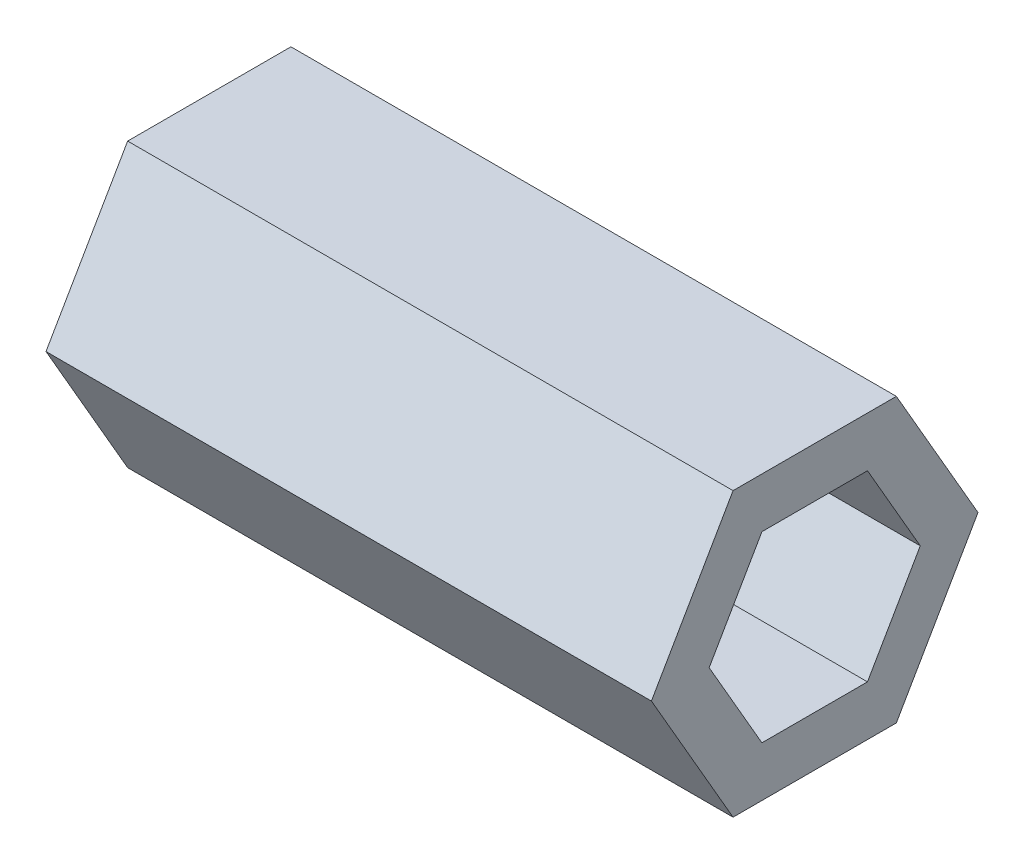
ISO-10303-21;
HEADER;
FILE_DESCRIPTION(('STEP AP214'),'2;1');
FILE_NAME('part.step','',(''),(''),'','','');
FILE_SCHEMA(('AUTOMOTIVE_DESIGN { 1 0 10303 214 1 1 1 1 }'));
ENDSEC;
DATA;
#1=APPLICATION_CONTEXT('core data for automotive mechanical design processes');
#2=APPLICATION_PROTOCOL_DEFINITION('international standard','automotive_design',2000,#1);
#3=PRODUCT_CONTEXT('',#1,'mechanical');
#4=PRODUCT('Part','Part','',(#3));
#5=PRODUCT_RELATED_PRODUCT_CATEGORY('part','',(#4));
#6=PRODUCT_DEFINITION_FORMATION('','',#4);
#7=PRODUCT_DEFINITION_CONTEXT('part definition',#1,'design');
#8=PRODUCT_DEFINITION('design','',#6,#7);
#9=PRODUCT_DEFINITION_SHAPE('','',#8);
#10=(LENGTH_UNIT() NAMED_UNIT(*) SI_UNIT(.MILLI.,.METRE.));
#11=(NAMED_UNIT(*) PLANE_ANGLE_UNIT() SI_UNIT($,.RADIAN.));
#12=(NAMED_UNIT(*) SI_UNIT($,.STERADIAN.) SOLID_ANGLE_UNIT());
#13=UNCERTAINTY_MEASURE_WITH_UNIT(LENGTH_MEASURE(1.E-05),#10,'distance_accuracy_value','');
#14=(GEOMETRIC_REPRESENTATION_CONTEXT(3) GLOBAL_UNCERTAINTY_ASSIGNED_CONTEXT((#13)) GLOBAL_UNIT_ASSIGNED_CONTEXT((#10,
#11,#12)) REPRESENTATION_CONTEXT('',''));
#15=CARTESIAN_POINT('',(0.,0.,0.));
#16=DIRECTION('',(0.,0.,1.));
#17=DIRECTION('',(1.,0.,0.));
#18=AXIS2_PLACEMENT_3D('',#15,#16,#17);
#19=CARTESIAN_POINT('',(2.54,0.,0.));
#20=DIRECTION('',(1.,0.,0.));
#21=DIRECTION('',(0.,0.,-1.));
#22=AXIS2_PLACEMENT_3D('',#19,#20,#21);
#23=PLANE('',#22);
#24=DIRECTION('',(0.,0.866025403784441,-0.499999999999995));
#25=VECTOR('',#24,1.);
#26=CARTESIAN_POINT('',(2.54,-5.33953978372522,-3.08278473148255));
#27=LINE('',#26,#25);
#28=CARTESIAN_POINT('',(2.54,-5.33953978372522,-3.08278473148255));
#29=VERTEX_POINT('',#28);
#30=CARTESIAN_POINT('',(2.54,0.,-6.16556946296498));
#31=VERTEX_POINT('',#30);
#32=EDGE_CURVE('E247',#29,#31,#27,.T.);
#33=ORIENTED_EDGE('',*,*,#32,.F.);
#34=DIRECTION('',(0.,0.,-1.));
#35=VECTOR('',#34,1.);
#36=CARTESIAN_POINT('',(2.54,-5.33953978372528,3.08278473148244));
#37=LINE('',#36,#35);
#38=CARTESIAN_POINT('',(2.54,-5.33953978372528,3.08278473148244));
#39=VERTEX_POINT('',#38);
#40=EDGE_CURVE('E263',#39,#29,#37,.T.);
#41=ORIENTED_EDGE('',*,*,#40,.F.);
#42=DIRECTION('',(0.,-0.866025403784435,-0.500000000000007));
#43=VECTOR('',#42,1.);
#44=CARTESIAN_POINT('',(2.54,0.,6.16556946296498));
#45=LINE('',#44,#43);
#46=CARTESIAN_POINT('',(2.54,0.,6.16556946296498));
#47=VERTEX_POINT('',#46);
#48=EDGE_CURVE('E260',#47,#39,#45,.T.);
#49=ORIENTED_EDGE('',*,*,#48,.F.);
#50=DIRECTION('',(0.,-0.866025403784441,0.499999999999995));
#51=VECTOR('',#50,1.);
#52=CARTESIAN_POINT('',(2.54,5.33953978372524,3.08278473148252));
#53=LINE('',#52,#51);
#54=CARTESIAN_POINT('',(2.54,5.33953978372524,3.08278473148252));
#55=VERTEX_POINT('',#54);
#56=EDGE_CURVE('E257',#55,#47,#53,.T.);
#57=ORIENTED_EDGE('',*,*,#56,.F.);
#58=DIRECTION('',(0.,0.,1.));
#59=VECTOR('',#58,1.);
#60=CARTESIAN_POINT('',(2.54,5.33953978372526,-3.08278473148248));
#61=LINE('',#60,#59);
#62=CARTESIAN_POINT('',(2.54,5.33953978372526,-3.08278473148248));
#63=VERTEX_POINT('',#62);
#64=EDGE_CURVE('E254',#63,#55,#61,.T.);
#65=ORIENTED_EDGE('',*,*,#64,.F.);
#66=DIRECTION('',(0.,0.866025403784438,0.500000000000001));
#67=VECTOR('',#66,1.);
#68=CARTESIAN_POINT('',(2.54,0.,-6.16556946296498));
#69=LINE('',#68,#67);
#70=EDGE_CURVE('E250',#31,#63,#69,.T.);
#71=ORIENTED_EDGE('',*,*,#70,.F.);
#72=EDGE_LOOP('',(#33,#41,#49,#57,#65,#71));
#73=FACE_BOUND('',#72,.T.);
#74=DIRECTION('',(0.,0.,-1.));
#75=VECTOR('',#74,1.);
#76=CARTESIAN_POINT('',(2.54,-3.46410161513776,2.));
#77=LINE('',#76,#75);
#78=CARTESIAN_POINT('',(2.54,-3.46410161513773,2.00000000000004));
#79=VERTEX_POINT('',#78);
#80=CARTESIAN_POINT('',(2.54,-3.46410161513777,-1.99999999999997));
#81=VERTEX_POINT('',#80);
#82=EDGE_CURVE('E11',#79,#81,#77,.T.);
#83=ORIENTED_EDGE('',*,*,#82,.T.);
#84=DIRECTION('',(0.,0.866025403784439,-0.5));
#85=VECTOR('',#84,1.);
#86=CARTESIAN_POINT('',(2.54,-3.46410161513776,-2.));
#87=LINE('',#86,#85);
#88=CARTESIAN_POINT('',(2.54,0.,-4.));
#89=VERTEX_POINT('',#88);
#90=EDGE_CURVE('E41',#81,#89,#87,.T.);
#91=ORIENTED_EDGE('',*,*,#90,.T.);
#92=DIRECTION('',(0.,0.866025403784439,0.5));
#93=VECTOR('',#92,1.);
#94=CARTESIAN_POINT('',(2.54,0.,-4.));
#95=LINE('',#94,#93);
#96=CARTESIAN_POINT('',(2.54,3.46410161513775,-2.00000000000002));
#97=VERTEX_POINT('',#96);
#98=EDGE_CURVE('E303',#89,#97,#95,.T.);
#99=ORIENTED_EDGE('',*,*,#98,.T.);
#100=DIRECTION('',(0.,0.,1.));
#101=VECTOR('',#100,1.);
#102=CARTESIAN_POINT('',(2.54,3.46410161513776,-2.));
#103=LINE('',#102,#101);
#104=CARTESIAN_POINT('',(2.54,3.46410161513776,1.99999999999999));
#105=VERTEX_POINT('',#104);
#106=EDGE_CURVE('E300',#97,#105,#103,.T.);
#107=ORIENTED_EDGE('',*,*,#106,.T.);
#108=DIRECTION('',(0.,-0.866025403784439,0.5));
#109=VECTOR('',#108,1.);
#110=CARTESIAN_POINT('',(2.54,3.46410161513776,2.));
#111=LINE('',#110,#109);
#112=CARTESIAN_POINT('',(2.54,0.,4.));
#113=VERTEX_POINT('',#112);
#114=EDGE_CURVE('E297',#105,#113,#111,.T.);
#115=ORIENTED_EDGE('',*,*,#114,.T.);
#116=DIRECTION('',(0.,-0.866025403784439,-0.5));
#117=VECTOR('',#116,1.);
#118=CARTESIAN_POINT('',(2.54,0.,4.));
#119=LINE('',#118,#117);
#120=EDGE_CURVE('E285',#113,#79,#119,.T.);
#121=ORIENTED_EDGE('',*,*,#120,.T.);
#122=EDGE_LOOP('',(#83,#91,#99,#107,#115,#121));
#123=FACE_BOUND('',#122,.T.);
#124=ADVANCED_FACE('F33',(#73,#123),#23,.F.);
#125=CARTESIAN_POINT('',(2.54,-5.33953978372522,-3.08278473148255));
#126=DIRECTION('',(0.,-0.499999999999995,-0.866025403784441));
#127=DIRECTION('',(0.,0.866025403784442,-0.499999999999995));
#128=AXIS2_PLACEMENT_3D('',#125,#126,#127);
#129=PLANE('',#128);
#130=DIRECTION('',(0.,0.866025403784441,-0.499999999999995));
#131=VECTOR('',#130,1.);
#132=CARTESIAN_POINT('',(25.4,-5.33953978372522,-3.08278473148255));
#133=LINE('',#132,#131);
#134=CARTESIAN_POINT('',(25.4,-5.33953978372522,-3.08278473148255));
#135=VERTEX_POINT('',#134);
#136=CARTESIAN_POINT('',(25.4,0.,-6.16556946296498));
#137=VERTEX_POINT('',#136);
#138=EDGE_CURVE('E233',#135,#137,#133,.T.);
#139=ORIENTED_EDGE('',*,*,#138,.F.);
#140=DIRECTION('',(1.,0.,0.));
#141=VECTOR('',#140,1.);
#142=CARTESIAN_POINT('',(2.54,-5.33953978372522,-3.08278473148255));
#143=LINE('',#142,#141);
#144=EDGE_CURVE('E283',#29,#135,#143,.T.);
#145=ORIENTED_EDGE('',*,*,#144,.F.);
#146=ORIENTED_EDGE('',*,*,#32,.T.);
#147=DIRECTION('',(1.,0.,0.));
#148=VECTOR('',#147,1.);
#149=CARTESIAN_POINT('',(2.54,0.,-6.16556946296498));
#150=LINE('',#149,#148);
#151=EDGE_CURVE('E266',#31,#137,#150,.T.);
#152=ORIENTED_EDGE('',*,*,#151,.T.);
#153=EDGE_LOOP('',(#139,#145,#146,#152));
#154=FACE_BOUND('',#153,.T.);
#155=ADVANCED_FACE('F333',(#154),#129,.T.);
#156=CARTESIAN_POINT('',(2.54,-5.33953978372528,3.08278473148244));
#157=DIRECTION('',(0.,-1.,0.));
#158=DIRECTION('',(0.,0.,-1.));
#159=AXIS2_PLACEMENT_3D('',#156,#157,#158);
#160=PLANE('',#159);
#161=DIRECTION('',(0.,0.,-1.));
#162=VECTOR('',#161,1.);
#163=CARTESIAN_POINT('',(25.4,-5.33953978372528,3.08278473148244));
#164=LINE('',#163,#162);
#165=CARTESIAN_POINT('',(25.4,-5.33953978372528,3.08278473148244));
#166=VERTEX_POINT('',#165);
#167=EDGE_CURVE('E251',#166,#135,#164,.T.);
#168=ORIENTED_EDGE('',*,*,#167,.F.);
#169=DIRECTION('',(1.,0.,0.));
#170=VECTOR('',#169,1.);
#171=CARTESIAN_POINT('',(2.54,-5.33953978372528,3.08278473148244));
#172=LINE('',#171,#170);
#173=EDGE_CURVE('E286',#39,#166,#172,.T.);
#174=ORIENTED_EDGE('',*,*,#173,.F.);
#175=ORIENTED_EDGE('',*,*,#40,.T.);
#176=ORIENTED_EDGE('',*,*,#144,.T.);
#177=EDGE_LOOP('',(#168,#174,#175,#176));
#178=FACE_BOUND('',#177,.T.);
#179=ADVANCED_FACE('F339',(#178),#160,.T.);
#180=CARTESIAN_POINT('',(2.54,0.,6.16556946296498));
#181=DIRECTION('',(0.,-0.500000000000007,0.866025403784434));
#182=DIRECTION('',(0.,-0.866025403784435,-0.500000000000007));
#183=AXIS2_PLACEMENT_3D('',#180,#181,#182);
#184=PLANE('',#183);
#185=DIRECTION('',(0.,-0.866025403784435,-0.500000000000007));
#186=VECTOR('',#185,1.);
#187=CARTESIAN_POINT('',(25.4,0.,6.16556946296498));
#188=LINE('',#187,#186);
#189=CARTESIAN_POINT('',(25.4,0.,6.16556946296498));
#190=VERTEX_POINT('',#189);
#191=EDGE_CURVE('E278',#190,#166,#188,.T.);
#192=ORIENTED_EDGE('',*,*,#191,.F.);
#193=DIRECTION('',(1.,0.,0.));
#194=VECTOR('',#193,1.);
#195=CARTESIAN_POINT('',(2.54,0.,6.16556946296498));
#196=LINE('',#195,#194);
#197=EDGE_CURVE('E288',#47,#190,#196,.T.);
#198=ORIENTED_EDGE('',*,*,#197,.F.);
#199=ORIENTED_EDGE('',*,*,#48,.T.);
#200=ORIENTED_EDGE('',*,*,#173,.T.);
#201=EDGE_LOOP('',(#192,#198,#199,#200));
#202=FACE_BOUND('',#201,.T.);
#203=ADVANCED_FACE('F346',(#202),#184,.T.);
#204=CARTESIAN_POINT('',(2.54,5.33953978372524,3.08278473148252));
#205=DIRECTION('',(0.,0.499999999999995,0.866025403784441));
#206=DIRECTION('',(0.,-0.866025403784442,0.499999999999995));
#207=AXIS2_PLACEMENT_3D('',#204,#205,#206);
#208=PLANE('',#207);
#209=DIRECTION('',(0.,-0.866025403784441,0.499999999999995));
#210=VECTOR('',#209,1.);
#211=CARTESIAN_POINT('',(25.4,5.33953978372524,3.08278473148252));
#212=LINE('',#211,#210);
#213=CARTESIAN_POINT('',(25.4,5.33953978372524,3.08278473148252));
#214=VERTEX_POINT('',#213);
#215=EDGE_CURVE('E275',#214,#190,#212,.T.);
#216=ORIENTED_EDGE('',*,*,#215,.F.);
#217=DIRECTION('',(1.,0.,0.));
#218=VECTOR('',#217,1.);
#219=CARTESIAN_POINT('',(2.54,5.33953978372524,3.08278473148252));
#220=LINE('',#219,#218);
#221=EDGE_CURVE('E290',#55,#214,#220,.T.);
#222=ORIENTED_EDGE('',*,*,#221,.F.);
#223=ORIENTED_EDGE('',*,*,#56,.T.);
#224=ORIENTED_EDGE('',*,*,#197,.T.);
#225=EDGE_LOOP('',(#216,#222,#223,#224));
#226=FACE_BOUND('',#225,.T.);
#227=ADVANCED_FACE('F350',(#226),#208,.T.);
#228=CARTESIAN_POINT('',(2.54,5.33953978372526,-3.08278473148248));
#229=DIRECTION('',(0.,1.,0.));
#230=DIRECTION('',(0.,0.,1.));
#231=AXIS2_PLACEMENT_3D('',#228,#229,#230);
#232=PLANE('',#231);
#233=DIRECTION('',(0.,0.,1.));
#234=VECTOR('',#233,1.);
#235=CARTESIAN_POINT('',(25.4,5.33953978372526,-3.08278473148248));
#236=LINE('',#235,#234);
#237=CARTESIAN_POINT('',(25.4,5.33953978372526,-3.08278473148248));
#238=VERTEX_POINT('',#237);
#239=EDGE_CURVE('E272',#238,#214,#236,.T.);
#240=ORIENTED_EDGE('',*,*,#239,.F.);
#241=DIRECTION('',(1.,0.,0.));
#242=VECTOR('',#241,1.);
#243=CARTESIAN_POINT('',(2.54,5.33953978372526,-3.08278473148248));
#244=LINE('',#243,#242);
#245=EDGE_CURVE('E292',#63,#238,#244,.T.);
#246=ORIENTED_EDGE('',*,*,#245,.F.);
#247=ORIENTED_EDGE('',*,*,#64,.T.);
#248=ORIENTED_EDGE('',*,*,#221,.T.);
#249=EDGE_LOOP('',(#240,#246,#247,#248));
#250=FACE_BOUND('',#249,.T.);
#251=ADVANCED_FACE('F354',(#250),#232,.T.);
#252=CARTESIAN_POINT('',(2.54,0.,-6.16556946296498));
#253=DIRECTION('',(0.,0.500000000000001,-0.866025403784438));
#254=DIRECTION('',(0.,0.866025403784438,0.500000000000001));
#255=AXIS2_PLACEMENT_3D('',#252,#253,#254);
#256=PLANE('',#255);
#257=DIRECTION('',(0.,0.866025403784438,0.500000000000001));
#258=VECTOR('',#257,1.);
#259=CARTESIAN_POINT('',(25.4,0.,-6.16556946296498));
#260=LINE('',#259,#258);
#261=EDGE_CURVE('E269',#137,#238,#260,.T.);
#262=ORIENTED_EDGE('',*,*,#261,.F.);
#263=ORIENTED_EDGE('',*,*,#151,.F.);
#264=ORIENTED_EDGE('',*,*,#70,.T.);
#265=ORIENTED_EDGE('',*,*,#245,.T.);
#266=EDGE_LOOP('',(#262,#263,#264,#265));
#267=FACE_BOUND('',#266,.T.);
#268=ADVANCED_FACE('F358',(#267),#256,.T.);
#269=CARTESIAN_POINT('',(25.4,0.,0.));
#270=DIRECTION('',(1.,0.,0.));
#271=DIRECTION('',(0.,0.,-1.));
#272=AXIS2_PLACEMENT_3D('',#269,#270,#271);
#273=PLANE('',#272);
#274=DIRECTION('',(0.,0.866025403784434,0.500000000000007));
#275=VECTOR('',#274,1.);
#276=CARTESIAN_POINT('',(25.4,0.,-3.98569157307371));
#277=LINE('',#276,#275);
#278=CARTESIAN_POINT('',(25.4,0.,-3.98569157307371));
#279=VERTEX_POINT('',#278);
#280=CARTESIAN_POINT('',(25.4,3.4517101539314,-1.99284578653685));
#281=VERTEX_POINT('',#280);
#282=EDGE_CURVE('E48',#279,#281,#277,.T.);
#283=ORIENTED_EDGE('',*,*,#282,.F.);
#284=DIRECTION('',(0.,0.866025403784445,-0.499999999999989));
#285=VECTOR('',#284,1.);
#286=CARTESIAN_POINT('',(25.4,-3.45171015393137,-1.9928457865369));
#287=LINE('',#286,#285);
#288=CARTESIAN_POINT('',(25.4,-3.45171015393137,-1.9928457865369));
#289=VERTEX_POINT('',#288);
#290=EDGE_CURVE('E179',#289,#279,#287,.T.);
#291=ORIENTED_EDGE('',*,*,#290,.F.);
#292=DIRECTION('',(0.,0.,-1.));
#293=VECTOR('',#292,1.);
#294=CARTESIAN_POINT('',(25.4,-3.45171015393141,1.99284578653682));
#295=LINE('',#294,#293);
#296=CARTESIAN_POINT('',(25.4,-3.45171015393141,1.99284578653682));
#297=VERTEX_POINT('',#296);
#298=EDGE_CURVE('E182',#297,#289,#295,.T.);
#299=ORIENTED_EDGE('',*,*,#298,.F.);
#300=DIRECTION('',(0.,-0.866025403784435,-0.500000000000007));
#301=VECTOR('',#300,1.);
#302=CARTESIAN_POINT('',(25.4,0.,3.98569157307371));
#303=LINE('',#302,#301);
#304=CARTESIAN_POINT('',(25.4,0.,3.98569157307371));
#305=VERTEX_POINT('',#304);
#306=EDGE_CURVE('E198',#305,#297,#303,.T.);
#307=ORIENTED_EDGE('',*,*,#306,.F.);
#308=DIRECTION('',(0.,-0.866025403784442,0.499999999999995));
#309=VECTOR('',#308,1.);
#310=CARTESIAN_POINT('',(25.4,3.45171015393139,1.99284578653687));
#311=LINE('',#310,#309);
#312=CARTESIAN_POINT('',(25.4,3.45171015393139,1.99284578653687));
#313=VERTEX_POINT('',#312);
#314=EDGE_CURVE('E195',#313,#305,#311,.T.);
#315=ORIENTED_EDGE('',*,*,#314,.F.);
#316=DIRECTION('',(0.,0.,1.));
#317=VECTOR('',#316,1.);
#318=CARTESIAN_POINT('',(25.4,3.4517101539314,-1.99284578653685));
#319=LINE('',#318,#317);
#320=EDGE_CURVE('E193',#281,#313,#319,.T.);
#321=ORIENTED_EDGE('',*,*,#320,.F.);
#322=EDGE_LOOP('',(#283,#291,#299,#307,#315,#321));
#323=FACE_BOUND('',#322,.T.);
#324=ORIENTED_EDGE('',*,*,#138,.T.);
#325=ORIENTED_EDGE('',*,*,#261,.T.);
#326=ORIENTED_EDGE('',*,*,#239,.T.);
#327=ORIENTED_EDGE('',*,*,#215,.T.);
#328=ORIENTED_EDGE('',*,*,#191,.T.);
#329=ORIENTED_EDGE('',*,*,#167,.T.);
#330=EDGE_LOOP('',(#324,#325,#326,#327,#328,#329));
#331=FACE_BOUND('',#330,.T.);
#332=ADVANCED_FACE('F35',(#323,#331),#273,.T.);
#333=CARTESIAN_POINT('',(10.16,-3.46410161513773,2.00000000000004));
#334=DIRECTION('',(0.,-0.499999999999995,0.866025403784441));
#335=DIRECTION('',(0.,-0.866025403784441,-0.499999999999995));
#336=AXIS2_PLACEMENT_3D('',#333,#334,#335);
#337=PLANE('',#336);
#338=DIRECTION('',(-1.,0.,0.));
#339=VECTOR('',#338,1.);
#340=CARTESIAN_POINT('',(10.16,0.,4.));
#341=LINE('',#340,#339);
#342=CARTESIAN_POINT('',(10.16,0.,4.));
#343=VERTEX_POINT('',#342);
#344=EDGE_CURVE('E56',#343,#113,#341,.T.);
#345=ORIENTED_EDGE('',*,*,#344,.F.);
#346=DIRECTION('',(0.,0.866025403784441,0.499999999999995));
#347=VECTOR('',#346,1.);
#348=CARTESIAN_POINT('',(10.16,-3.46410161513773,2.00000000000004));
#349=LINE('',#348,#347);
#350=CARTESIAN_POINT('',(10.16,-3.46410161513773,2.00000000000004));
#351=VERTEX_POINT('',#350);
#352=EDGE_CURVE('E205',#351,#343,#349,.T.);
#353=ORIENTED_EDGE('',*,*,#352,.F.);
#354=DIRECTION('',(-1.,0.,0.));
#355=VECTOR('',#354,1.);
#356=CARTESIAN_POINT('',(10.16,-3.46410161513773,2.00000000000004));
#357=LINE('',#356,#355);
#358=EDGE_CURVE('E230',#351,#79,#357,.T.);
#359=ORIENTED_EDGE('',*,*,#358,.T.);
#360=ORIENTED_EDGE('',*,*,#120,.F.);
#361=EDGE_LOOP('',(#345,#353,#359,#360));
#362=FACE_BOUND('',#361,.T.);
#363=ADVANCED_FACE('F343',(#362),#337,.F.);
#364=CARTESIAN_POINT('',(10.16,-3.46410161513777,-1.99999999999997));
#365=DIRECTION('',(0.,-1.,0.));
#366=DIRECTION('',(0.,0.,-1.));
#367=AXIS2_PLACEMENT_3D('',#364,#365,#366);
#368=PLANE('',#367);
#369=ORIENTED_EDGE('',*,*,#358,.F.);
#370=DIRECTION('',(0.,0.,1.));
#371=VECTOR('',#370,1.);
#372=CARTESIAN_POINT('',(10.16,-3.46410161513777,-1.99999999999997));
#373=LINE('',#372,#371);
#374=CARTESIAN_POINT('',(10.16,-3.46410161513777,-1.99999999999997));
#375=VERTEX_POINT('',#374);
#376=EDGE_CURVE('E227',#375,#351,#373,.T.);
#377=ORIENTED_EDGE('',*,*,#376,.F.);
#378=DIRECTION('',(-1.,0.,0.));
#379=VECTOR('',#378,1.);
#380=CARTESIAN_POINT('',(10.16,-3.46410161513777,-1.99999999999997));
#381=LINE('',#380,#379);
#382=EDGE_CURVE('E234',#375,#81,#381,.T.);
#383=ORIENTED_EDGE('',*,*,#382,.T.);
#384=ORIENTED_EDGE('',*,*,#82,.F.);
#385=EDGE_LOOP('',(#369,#377,#383,#384));
#386=FACE_BOUND('',#385,.T.);
#387=ADVANCED_FACE('F312',(#386),#368,.F.);
#388=CARTESIAN_POINT('',(10.16,0.,-4.));
#389=DIRECTION('',(0.,-0.500000000000007,-0.866025403784435));
#390=DIRECTION('',(0.,0.866025403784435,-0.500000000000007));
#391=AXIS2_PLACEMENT_3D('',#388,#389,#390);
#392=PLANE('',#391);
#393=ORIENTED_EDGE('',*,*,#382,.F.);
#394=DIRECTION('',(0.,-0.866025403784435,0.500000000000007));
#395=VECTOR('',#394,1.);
#396=CARTESIAN_POINT('',(10.16,0.,-4.));
#397=LINE('',#396,#395);
#398=CARTESIAN_POINT('',(10.16,0.,-4.));
#399=VERTEX_POINT('',#398);
#400=EDGE_CURVE('E224',#399,#375,#397,.T.);
#401=ORIENTED_EDGE('',*,*,#400,.F.);
#402=DIRECTION('',(-1.,0.,0.));
#403=VECTOR('',#402,1.);
#404=CARTESIAN_POINT('',(10.16,0.,-4.));
#405=LINE('',#404,#403);
#406=EDGE_CURVE('E237',#399,#89,#405,.T.);
#407=ORIENTED_EDGE('',*,*,#406,.T.);
#408=ORIENTED_EDGE('',*,*,#90,.F.);
#409=EDGE_LOOP('',(#393,#401,#407,#408));
#410=FACE_BOUND('',#409,.T.);
#411=ADVANCED_FACE('F308',(#410),#392,.F.);
#412=CARTESIAN_POINT('',(10.16,3.46410161513775,-2.00000000000002));
#413=DIRECTION('',(0.,0.499999999999995,-0.866025403784441));
#414=DIRECTION('',(0.,0.866025403784441,0.499999999999995));
#415=AXIS2_PLACEMENT_3D('',#412,#413,#414);
#416=PLANE('',#415);
#417=ORIENTED_EDGE('',*,*,#406,.F.);
#418=DIRECTION('',(0.,-0.866025403784441,-0.499999999999995));
#419=VECTOR('',#418,1.);
#420=CARTESIAN_POINT('',(10.16,3.46410161513775,-2.00000000000002));
#421=LINE('',#420,#419);
#422=CARTESIAN_POINT('',(10.16,3.46410161513775,-2.00000000000002));
#423=VERTEX_POINT('',#422);
#424=EDGE_CURVE('E221',#423,#399,#421,.T.);
#425=ORIENTED_EDGE('',*,*,#424,.F.);
#426=DIRECTION('',(-1.,0.,0.));
#427=VECTOR('',#426,1.);
#428=CARTESIAN_POINT('',(10.16,3.46410161513775,-2.00000000000002));
#429=LINE('',#428,#427);
#430=EDGE_CURVE('E240',#423,#97,#429,.T.);
#431=ORIENTED_EDGE('',*,*,#430,.T.);
#432=ORIENTED_EDGE('',*,*,#98,.F.);
#433=EDGE_LOOP('',(#417,#425,#431,#432));
#434=FACE_BOUND('',#433,.T.);
#435=ADVANCED_FACE('F319',(#434),#416,.F.);
#436=CARTESIAN_POINT('',(10.16,3.46410161513776,1.99999999999999));
#437=DIRECTION('',(0.,1.,0.));
#438=DIRECTION('',(0.,0.,1.));
#439=AXIS2_PLACEMENT_3D('',#436,#437,#438);
#440=PLANE('',#439);
#441=ORIENTED_EDGE('',*,*,#430,.F.);
#442=DIRECTION('',(0.,0.,-1.));
#443=VECTOR('',#442,1.);
#444=CARTESIAN_POINT('',(10.16,3.46410161513776,1.99999999999999));
#445=LINE('',#444,#443);
#446=CARTESIAN_POINT('',(10.16,3.46410161513776,1.99999999999999));
#447=VERTEX_POINT('',#446);
#448=EDGE_CURVE('E218',#447,#423,#445,.T.);
#449=ORIENTED_EDGE('',*,*,#448,.F.);
#450=DIRECTION('',(-1.,0.,0.));
#451=VECTOR('',#450,1.);
#452=CARTESIAN_POINT('',(10.16,3.46410161513776,1.99999999999999));
#453=LINE('',#452,#451);
#454=EDGE_CURVE('E243',#447,#105,#453,.T.);
#455=ORIENTED_EDGE('',*,*,#454,.T.);
#456=ORIENTED_EDGE('',*,*,#106,.F.);
#457=EDGE_LOOP('',(#441,#449,#455,#456));
#458=FACE_BOUND('',#457,.T.);
#459=ADVANCED_FACE('F321',(#458),#440,.F.);
#460=CARTESIAN_POINT('',(10.16,0.,4.));
#461=DIRECTION('',(0.,0.500000000000001,0.866025403784438));
#462=DIRECTION('',(0.,-0.866025403784438,0.500000000000001));
#463=AXIS2_PLACEMENT_3D('',#460,#461,#462);
#464=PLANE('',#463);
#465=ORIENTED_EDGE('',*,*,#454,.F.);
#466=DIRECTION('',(0.,0.866025403784438,-0.500000000000001));
#467=VECTOR('',#466,1.);
#468=CARTESIAN_POINT('',(10.16,0.,4.));
#469=LINE('',#468,#467);
#470=EDGE_CURVE('E215',#343,#447,#469,.T.);
#471=ORIENTED_EDGE('',*,*,#470,.F.);
#472=ORIENTED_EDGE('',*,*,#344,.T.);
#473=ORIENTED_EDGE('',*,*,#114,.F.);
#474=EDGE_LOOP('',(#465,#471,#472,#473));
#475=FACE_BOUND('',#474,.T.);
#476=ADVANCED_FACE('F322',(#475),#464,.F.);
#477=CARTESIAN_POINT('',(10.16,0.,0.));
#478=DIRECTION('',(-1.,0.,0.));
#479=DIRECTION('',(0.,0.,1.));
#480=AXIS2_PLACEMENT_3D('',#477,#478,#479);
#481=PLANE('',#480);
#482=ORIENTED_EDGE('',*,*,#352,.T.);
#483=ORIENTED_EDGE('',*,*,#470,.T.);
#484=ORIENTED_EDGE('',*,*,#448,.T.);
#485=ORIENTED_EDGE('',*,*,#424,.T.);
#486=ORIENTED_EDGE('',*,*,#400,.T.);
#487=ORIENTED_EDGE('',*,*,#376,.T.);
#488=EDGE_LOOP('',(#482,#483,#484,#485,#486,#487));
#489=FACE_BOUND('',#488,.T.);
#490=ADVANCED_FACE('F315',(#489),#481,.T.);
#491=CARTESIAN_POINT('',(15.24,0.,-3.98569157307371));
#492=DIRECTION('',(0.,0.500000000000007,-0.866025403784435));
#493=DIRECTION('',(0.,0.866025403784435,0.500000000000007));
#494=AXIS2_PLACEMENT_3D('',#491,#492,#493);
#495=PLANE('',#494);
#496=ORIENTED_EDGE('',*,*,#282,.T.);
#497=DIRECTION('',(1.,0.,0.));
#498=VECTOR('',#497,1.);
#499=CARTESIAN_POINT('',(15.24,3.4517101539314,-1.99284578653685));
#500=LINE('',#499,#498);
#501=CARTESIAN_POINT('',(15.24,3.4517101539314,-1.99284578653685));
#502=VERTEX_POINT('',#501);
#503=EDGE_CURVE('E156',#502,#281,#500,.T.);
#504=ORIENTED_EDGE('',*,*,#503,.F.);
#505=DIRECTION('',(0.,0.866025403784434,0.500000000000007));
#506=VECTOR('',#505,1.);
#507=CARTESIAN_POINT('',(15.24,0.,-3.98569157307371));
#508=LINE('',#507,#506);
#509=CARTESIAN_POINT('',(15.24,0.,-3.98569157307371));
#510=VERTEX_POINT('',#509);
#511=EDGE_CURVE('E160',#510,#502,#508,.T.);
#512=ORIENTED_EDGE('',*,*,#511,.F.);
#513=DIRECTION('',(1.,0.,0.));
#514=VECTOR('',#513,1.);
#515=CARTESIAN_POINT('',(15.24,0.,-3.98569157307371));
#516=LINE('',#515,#514);
#517=EDGE_CURVE('E203',#510,#279,#516,.T.);
#518=ORIENTED_EDGE('',*,*,#517,.T.);
#519=EDGE_LOOP('',(#496,#504,#512,#518));
#520=FACE_BOUND('',#519,.T.);
#521=ADVANCED_FACE('F158',(#520),#495,.F.);
#522=CARTESIAN_POINT('',(15.24,-3.45171015393137,-1.9928457865369));
#523=DIRECTION('',(0.,-0.499999999999989,-0.866025403784445));
#524=DIRECTION('',(0.,0.866025403784445,-0.499999999999989));
#525=AXIS2_PLACEMENT_3D('',#522,#523,#524);
#526=PLANE('',#525);
#527=ORIENTED_EDGE('',*,*,#290,.T.);
#528=ORIENTED_EDGE('',*,*,#517,.F.);
#529=DIRECTION('',(0.,0.866025403784445,-0.499999999999989));
#530=VECTOR('',#529,1.);
#531=CARTESIAN_POINT('',(15.24,-3.45171015393137,-1.9928457865369));
#532=LINE('',#531,#530);
#533=CARTESIAN_POINT('',(15.24,-3.45171015393137,-1.9928457865369));
#534=VERTEX_POINT('',#533);
#535=EDGE_CURVE('E166',#534,#510,#532,.T.);
#536=ORIENTED_EDGE('',*,*,#535,.F.);
#537=DIRECTION('',(1.,0.,0.));
#538=VECTOR('',#537,1.);
#539=CARTESIAN_POINT('',(15.24,-3.45171015393137,-1.9928457865369));
#540=LINE('',#539,#538);
#541=EDGE_CURVE('E206',#534,#289,#540,.T.);
#542=ORIENTED_EDGE('',*,*,#541,.T.);
#543=EDGE_LOOP('',(#527,#528,#536,#542));
#544=FACE_BOUND('',#543,.T.);
#545=ADVANCED_FACE('F395',(#544),#526,.F.);
#546=CARTESIAN_POINT('',(15.24,-3.45171015393141,1.99284578653682));
#547=DIRECTION('',(0.,-1.,0.));
#548=DIRECTION('',(0.,0.,-1.));
#549=AXIS2_PLACEMENT_3D('',#546,#547,#548);
#550=PLANE('',#549);
#551=ORIENTED_EDGE('',*,*,#298,.T.);
#552=ORIENTED_EDGE('',*,*,#541,.F.);
#553=DIRECTION('',(0.,0.,-1.));
#554=VECTOR('',#553,1.);
#555=CARTESIAN_POINT('',(15.24,-3.45171015393141,1.99284578653682));
#556=LINE('',#555,#554);
#557=CARTESIAN_POINT('',(15.24,-3.45171015393141,1.99284578653682));
#558=VERTEX_POINT('',#557);
#559=EDGE_CURVE('E189',#558,#534,#556,.T.);
#560=ORIENTED_EDGE('',*,*,#559,.F.);
#561=DIRECTION('',(1.,0.,0.));
#562=VECTOR('',#561,1.);
#563=CARTESIAN_POINT('',(15.24,-3.45171015393141,1.99284578653682));
#564=LINE('',#563,#562);
#565=EDGE_CURVE('E208',#558,#297,#564,.T.);
#566=ORIENTED_EDGE('',*,*,#565,.T.);
#567=EDGE_LOOP('',(#551,#552,#560,#566));
#568=FACE_BOUND('',#567,.T.);
#569=ADVANCED_FACE('F393',(#568),#550,.F.);
#570=CARTESIAN_POINT('',(15.24,0.,3.98569157307371));
#571=DIRECTION('',(0.,-0.500000000000007,0.866025403784435));
#572=DIRECTION('',(0.,-0.866025403784435,-0.500000000000007));
#573=AXIS2_PLACEMENT_3D('',#570,#571,#572);
#574=PLANE('',#573);
#575=ORIENTED_EDGE('',*,*,#306,.T.);
#576=ORIENTED_EDGE('',*,*,#565,.F.);
#577=DIRECTION('',(0.,-0.866025403784435,-0.500000000000007));
#578=VECTOR('',#577,1.);
#579=CARTESIAN_POINT('',(15.24,0.,3.98569157307371));
#580=LINE('',#579,#578);
#581=CARTESIAN_POINT('',(15.24,0.,3.98569157307371));
#582=VERTEX_POINT('',#581);
#583=EDGE_CURVE('E186',#582,#558,#580,.T.);
#584=ORIENTED_EDGE('',*,*,#583,.F.);
#585=DIRECTION('',(1.,0.,0.));
#586=VECTOR('',#585,1.);
#587=CARTESIAN_POINT('',(15.24,0.,3.98569157307371));
#588=LINE('',#587,#586);
#589=EDGE_CURVE('E210',#582,#305,#588,.T.);
#590=ORIENTED_EDGE('',*,*,#589,.T.);
#591=EDGE_LOOP('',(#575,#576,#584,#590));
#592=FACE_BOUND('',#591,.T.);
#593=ADVANCED_FACE('F391',(#592),#574,.F.);
#594=CARTESIAN_POINT('',(15.24,3.45171015393139,1.99284578653687));
#595=DIRECTION('',(0.,0.499999999999995,0.866025403784442));
#596=DIRECTION('',(0.,-0.866025403784442,0.499999999999995));
#597=AXIS2_PLACEMENT_3D('',#594,#595,#596);
#598=PLANE('',#597);
#599=ORIENTED_EDGE('',*,*,#314,.T.);
#600=ORIENTED_EDGE('',*,*,#589,.F.);
#601=DIRECTION('',(0.,-0.866025403784442,0.499999999999995));
#602=VECTOR('',#601,1.);
#603=CARTESIAN_POINT('',(15.24,3.45171015393139,1.99284578653687));
#604=LINE('',#603,#602);
#605=CARTESIAN_POINT('',(15.24,3.45171015393139,1.99284578653687));
#606=VERTEX_POINT('',#605);
#607=EDGE_CURVE('E174',#606,#582,#604,.T.);
#608=ORIENTED_EDGE('',*,*,#607,.F.);
#609=DIRECTION('',(1.,0.,0.));
#610=VECTOR('',#609,1.);
#611=CARTESIAN_POINT('',(15.24,3.45171015393139,1.99284578653687));
#612=LINE('',#611,#610);
#613=EDGE_CURVE('E165',#606,#313,#612,.T.);
#614=ORIENTED_EDGE('',*,*,#613,.T.);
#615=EDGE_LOOP('',(#599,#600,#608,#614));
#616=FACE_BOUND('',#615,.T.);
#617=ADVANCED_FACE('F387',(#616),#598,.F.);
#618=CARTESIAN_POINT('',(15.24,3.4517101539314,-1.99284578653685));
#619=DIRECTION('',(0.,1.,0.));
#620=DIRECTION('',(0.,0.,1.));
#621=AXIS2_PLACEMENT_3D('',#618,#619,#620);
#622=PLANE('',#621);
#623=ORIENTED_EDGE('',*,*,#320,.T.);
#624=ORIENTED_EDGE('',*,*,#613,.F.);
#625=DIRECTION('',(0.,0.,1.));
#626=VECTOR('',#625,1.);
#627=CARTESIAN_POINT('',(15.24,3.4517101539314,-1.99284578653685));
#628=LINE('',#627,#626);
#629=EDGE_CURVE('E169',#502,#606,#628,.T.);
#630=ORIENTED_EDGE('',*,*,#629,.F.);
#631=ORIENTED_EDGE('',*,*,#503,.T.);
#632=EDGE_LOOP('',(#623,#624,#630,#631));
#633=FACE_BOUND('',#632,.T.);
#634=ADVANCED_FACE('F170',(#633),#622,.F.);
#635=CARTESIAN_POINT('',(15.24,0.,0.));
#636=DIRECTION('',(1.,0.,0.));
#637=DIRECTION('',(0.,0.,-1.));
#638=AXIS2_PLACEMENT_3D('',#635,#636,#637);
#639=PLANE('',#638);
#640=ORIENTED_EDGE('',*,*,#511,.T.);
#641=ORIENTED_EDGE('',*,*,#629,.T.);
#642=ORIENTED_EDGE('',*,*,#607,.T.);
#643=ORIENTED_EDGE('',*,*,#583,.T.);
#644=ORIENTED_EDGE('',*,*,#559,.T.);
#645=ORIENTED_EDGE('',*,*,#535,.T.);
#646=EDGE_LOOP('',(#640,#641,#642,#643,#644,#645));
#647=FACE_BOUND('',#646,.T.);
#648=ADVANCED_FACE('F176',(#647),#639,.T.);
#649=CLOSED_SHELL('',(#124,#155,#179,#203,#227,#251,#268,#332,#363,#387,#411,#435,#459,#476,
#490,#521,#545,#569,#593,#617,#634,#648));
#650=MANIFOLD_SOLID_BREP('B2',#649);
#651=ADVANCED_BREP_SHAPE_REPRESENTATION('',(#18,#650),#14);
#652=SHAPE_DEFINITION_REPRESENTATION(#9,#651);
ENDSEC;
END-ISO-10303-21;
